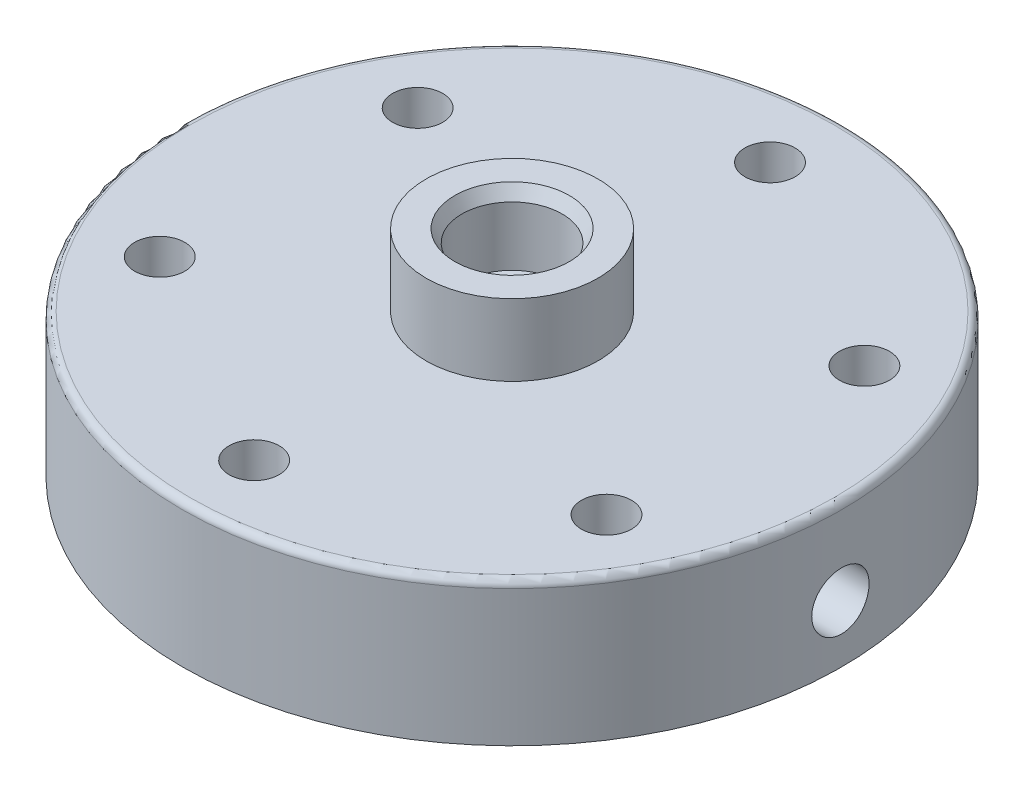
ISO-10303-21;
HEADER;
FILE_DESCRIPTION(('STEP AP214'),'2;1');
FILE_NAME('part.step','',(''),(''),'','','');
FILE_SCHEMA(('AUTOMOTIVE_DESIGN { 1 0 10303 214 1 1 1 1 }'));
ENDSEC;
DATA;
#1=APPLICATION_CONTEXT('core data for automotive mechanical design processes');
#2=APPLICATION_PROTOCOL_DEFINITION('international standard','automotive_design',2000,#1);
#3=PRODUCT_CONTEXT('',#1,'mechanical');
#4=PRODUCT('Part','Part','',(#3));
#5=PRODUCT_RELATED_PRODUCT_CATEGORY('part','',(#4));
#6=PRODUCT_DEFINITION_FORMATION('','',#4);
#7=PRODUCT_DEFINITION_CONTEXT('part definition',#1,'design');
#8=PRODUCT_DEFINITION('design','',#6,#7);
#9=PRODUCT_DEFINITION_SHAPE('','',#8);
#10=(LENGTH_UNIT() NAMED_UNIT(*) SI_UNIT(.MILLI.,.METRE.));
#11=(NAMED_UNIT(*) PLANE_ANGLE_UNIT() SI_UNIT($,.RADIAN.));
#12=(NAMED_UNIT(*) SI_UNIT($,.STERADIAN.) SOLID_ANGLE_UNIT());
#13=UNCERTAINTY_MEASURE_WITH_UNIT(LENGTH_MEASURE(1.E-05),#10,'distance_accuracy_value','');
#14=(GEOMETRIC_REPRESENTATION_CONTEXT(3) GLOBAL_UNCERTAINTY_ASSIGNED_CONTEXT((#13)) GLOBAL_UNIT_ASSIGNED_CONTEXT((#10,
#11,#12)) REPRESENTATION_CONTEXT('',''));
#15=CARTESIAN_POINT('',(0.,0.,0.));
#16=DIRECTION('',(0.,0.,1.));
#17=DIRECTION('',(1.,0.,0.));
#18=AXIS2_PLACEMENT_3D('',#15,#16,#17);
#19=CARTESIAN_POINT('',(0.,20.,0.));
#20=DIRECTION('',(0.,-1.,0.));
#21=DIRECTION('',(0.,0.,-1.));
#22=AXIS2_PLACEMENT_3D('',#19,#20,#21);
#23=CYLINDRICAL_SURFACE('',#22,46.);
#24=CARTESIAN_POINT('',(0.,19.,0.));
#25=DIRECTION('',(0.,1.,0.));
#26=DIRECTION('',(0.,0.,1.));
#27=AXIS2_PLACEMENT_3D('',#24,#25,#26);
#28=CIRCLE('',#27,46.);
#29=CARTESIAN_POINT('',(0.,19.,46.));
#30=VERTEX_POINT('',#29);
#31=EDGE_CURVE('E197',#30,#30,#28,.F.);
#32=ORIENTED_EDGE('',*,*,#31,.T.);
#33=EDGE_LOOP('',(#32));
#34=FACE_BOUND('',#33,.T.);
#35=CARTESIAN_POINT('',(0.,0.,0.));
#36=DIRECTION('',(0.,1.,0.));
#37=DIRECTION('',(0.,0.,1.));
#38=AXIS2_PLACEMENT_3D('',#35,#36,#37);
#39=CIRCLE('',#38,46.);
#40=CARTESIAN_POINT('',(0.,0.,46.));
#41=VERTEX_POINT('',#40);
#42=EDGE_CURVE('E184',#41,#41,#39,.T.);
#43=ORIENTED_EDGE('',*,*,#42,.T.);
#44=EDGE_LOOP('',(#43));
#45=FACE_BOUND('',#44,.T.);
#46=CARTESIAN_POINT('',(45.8257569495584,8.,4.));
#47=CARTESIAN_POINT('',(45.8257592529,7.77577442323266,3.99999022069832));
#48=CARTESIAN_POINT('',(45.827420373911,7.55139708322895,3.98108264099248));
#49=CARTESIAN_POINT('',(45.8338851426979,7.1088531947813,3.90593649586812));
#50=CARTESIAN_POINT('',(45.8386923314329,6.89069393397172,3.84965586532193));
#51=CARTESIAN_POINT('',(45.8509006782946,6.46705961781166,3.70140589755577));
#52=CARTESIAN_POINT('',(45.8583003450063,6.26157734933525,3.60945707647571));
#53=CARTESIAN_POINT('',(45.8748580339149,5.8690110494097,3.39251792049866));
#54=CARTESIAN_POINT('',(45.8840156854883,5.68192315255496,3.26753454795257));
#55=CARTESIAN_POINT('',(45.9030861076185,5.33088765545785,2.98769880141533));
#56=CARTESIAN_POINT('',(45.913000687119,5.16699834195564,2.83277342711226));
#57=CARTESIAN_POINT('',(45.9324513082598,4.8675132290469,2.49760627828392));
#58=CARTESIAN_POINT('',(45.9419873331913,4.73191867740846,2.31736338787004));
#59=CARTESIAN_POINT('',(45.9596237085428,4.49267637006845,1.93632769735621));
#60=CARTESIAN_POINT('',(45.9677217712603,4.38907933009617,1.73550293927632));
#61=CARTESIAN_POINT('',(45.9815502523707,4.21709718919268,1.31922689103131));
#62=CARTESIAN_POINT('',(45.9872807154839,4.14871142316868,1.10377587722316));
#63=CARTESIAN_POINT('',(45.9957156744668,4.04926161183604,0.664945572705922));
#64=CARTESIAN_POINT('',(45.9984278444434,4.01810290062262,0.441587885472249));
#65=CARTESIAN_POINT('',(46.0005466562249,3.99369898127485,-0.00720231248861332));
#66=CARTESIAN_POINT('',(45.9999533644024,4.00045301186608,-0.232634781464177));
#67=CARTESIAN_POINT('',(45.9955344216359,4.05160555151024,-0.678533303383719));
#68=CARTESIAN_POINT('',(45.9917175116836,4.09590226296142,-0.899011133019084));
#69=CARTESIAN_POINT('',(45.9812906260433,4.22072439612973,-1.32939055972902));
#70=CARTESIAN_POINT('',(45.9746806217873,4.30125018840196,-1.53929204860316));
#71=CARTESIAN_POINT('',(45.9593960403952,4.4963577352682,-1.94288377568549));
#72=CARTESIAN_POINT('',(45.9507187091837,4.61098497061715,-2.13655191869819));
#73=CARTESIAN_POINT('',(45.932274323738,4.8710085348327,-2.50193828147549));
#74=CARTESIAN_POINT('',(45.9225072454084,5.01640554411558,-2.67365601571295));
#75=CARTESIAN_POINT('',(45.9029425505567,5.33441486008561,-2.99086253715119));
#76=CARTESIAN_POINT('',(45.8931449399444,5.50711564264318,-3.1362626395445));
#77=CARTESIAN_POINT('',(45.8746558920775,5.87452214786145,-3.39602107305605));
#78=CARTESIAN_POINT('',(45.865964455857,6.06922789109,-3.51037937515944));
#79=CARTESIAN_POINT('',(45.850670411278,6.47518079364158,-3.70480521446751));
#80=CARTESIAN_POINT('',(45.8440680940838,6.68643025357772,-3.78486797239148));
#81=CARTESIAN_POINT('',(45.8337056034403,7.11944348390513,-3.90836346467413));
#82=CARTESIAN_POINT('',(45.8299453648504,7.34120701318991,-3.95179703857705));
#83=CARTESIAN_POINT('',(45.8257035170242,7.78817678693571,-4.00068860868453));
#84=CARTESIAN_POINT('',(45.8252112237107,8.01336939766032,-4.00627035728181));
#85=CARTESIAN_POINT('',(45.8275328089982,8.46148703918565,-3.97962416771679));
#86=CARTESIAN_POINT('',(45.8303466539778,8.68441209302277,-3.94739661405193));
#87=CARTESIAN_POINT('',(45.8389537309647,9.12131022373808,-3.84614988501926));
#88=CARTESIAN_POINT('',(45.8447422732169,9.33529682004083,-3.77718861590927));
#89=CARTESIAN_POINT('',(45.858642654131,9.74866282147786,-3.60449093074963));
#90=CARTESIAN_POINT('',(45.8667545333191,9.94804197173726,-3.50075390809871));
#91=CARTESIAN_POINT('',(45.8844134825169,10.3270992880489,-3.26113691800223));
#92=CARTESIAN_POINT('',(45.8939642072595,10.5067252100852,-3.12517457760168));
#93=CARTESIAN_POINT('',(45.9134124490953,10.840648770394,-2.82508520773206));
#94=CARTESIAN_POINT('',(45.9233099726793,10.994945934287,-2.66095765087739));
#95=CARTESIAN_POINT('',(45.9423685156078,11.2742553361173,-2.30866162942055));
#96=CARTESIAN_POINT('',(45.9515274669664,11.3991871027076,-2.12042923775605));
#97=CARTESIAN_POINT('',(45.9680470345569,11.6156668888614,-1.72558473478786));
#98=CARTESIAN_POINT('',(45.9754076701262,11.7072152674032,-1.51897282115266));
#99=CARTESIAN_POINT('',(45.9874917831598,11.8541917289228,-1.09352107058706));
#100=CARTESIAN_POINT('',(45.9922188753643,11.9096693393661,-0.874698450214243));
#101=CARTESIAN_POINT('',(45.99851799679,11.9830912853287,-0.430801347321802));
#102=CARTESIAN_POINT('',(46.0000900915684,12.0010364007306,-0.205726994804518));
#103=CARTESIAN_POINT('',(45.9999021602536,11.9988744958374,0.243491894884627));
#104=CARTESIAN_POINT('',(45.9981531072966,11.9788927865902,0.467637050347374));
#105=CARTESIAN_POINT('',(45.9915410873719,11.9017060502011,0.90937492257315));
#106=CARTESIAN_POINT('',(45.9866781164929,11.8445009763045,1.12696763110556));
#107=CARTESIAN_POINT('',(45.9743837234326,11.6945238102343,1.54943018460914));
#108=CARTESIAN_POINT('',(45.9669524855247,11.6017542697615,1.75430094113752));
#109=CARTESIAN_POINT('',(45.9503523182712,11.3832956492401,2.1455808043822));
#110=CARTESIAN_POINT('',(45.9411834128787,11.2576070229602,2.33199016552824));
#111=CARTESIAN_POINT('',(45.9221005338321,10.9764075200983,2.68169741837223));
#112=CARTESIAN_POINT('',(45.9121842991298,10.820803736764,2.84492048041319));
#113=CARTESIAN_POINT('',(45.8927436381485,10.4843629460579,3.14300123474661));
#114=CARTESIAN_POINT('',(45.8832193071528,10.3035198486581,3.27785206131377));
#115=CARTESIAN_POINT('',(45.8656201830606,9.92135267465077,3.51556036878055));
#116=CARTESIAN_POINT('',(45.8575483364789,9.71998823540091,3.61835311929828));
#117=CARTESIAN_POINT('',(45.8438038501868,9.30292314647025,3.78853603666767));
#118=CARTESIAN_POINT('',(45.838128464102,9.08723923706336,3.85596675043421));
#119=CARTESIAN_POINT('',(45.8312733845173,8.72524412271519,3.93640984643492));
#120=CARTESIAN_POINT('',(45.8292142857283,8.58125842839594,3.96022427649646));
#121=CARTESIAN_POINT('',(45.8264553214086,8.29153654166246,3.99202250917625));
#122=CARTESIAN_POINT('',(45.8257554518344,8.14580035445712,4.00000635888943));
#123=CARTESIAN_POINT('',(45.8257569495584,8.,4.));
#124=B_SPLINE_CURVE_WITH_KNOTS('',3,(#46,#47,#48,#49,#50,#51,#52,#53,#54,#55,#56,#57,#58,#59,
#60,#61,#62,#63,#64,#65,#66,#67,#68,#69,#70,#71,#72,#73,#74,#75,#76,#77,#78,#79,#80,#81,#82,#83,
#84,#85,#86,#87,#88,#89,#90,#91,#92,#93,#94,#95,#96,#97,#98,#99,#100,#101,#102,#103,#104,#105,
#106,#107,#108,#109,#110,#111,#112,#113,#114,#115,#116,#117,#118,#119,#120,#121,#122,#123),
.UNSPECIFIED.,.T.,.F.,(4,2,2,2,2,2,2,2,2,2,2,2,2,2,2,2,2,2,2,2,2,2,2,2,2,2,2,2,2,2,2,2,2,2,2,2,
2,2,4),(0.,0.672144367468726,1.34504655027074,2.01756225611789,2.68993633564789,
3.36397086630315,4.03803511486633,4.71316232981279,5.38827679206224,6.06167080444288,
6.73505129535883,7.40661172404849,8.07817902168978,8.75064602815269,9.42312790652577,
10.0978353469387,10.7725434180003,11.4473454829356,12.1221320809255,12.7947114699811,
13.4672840193756,14.1387994635935,14.8103266218154,15.4835891813588,16.1568643489264,
16.8319635562739,17.5070555039268,18.1812185387189,18.8553675650324,19.5272930649873,
20.1992194089225,20.8710975521,21.5429664343535,22.2169566520649,22.8911097798494,
23.5666154470793,24.2413448612288,24.6784010614077,25.1154559613712),.UNSPECIFIED.);
#125=CARTESIAN_POINT('',(45.8257569495584,8.,4.));
#126=VERTEX_POINT('',#125);
#127=EDGE_CURVE('E246',#126,#126,#124,.T.);
#128=ORIENTED_EDGE('',*,*,#127,.F.);
#129=EDGE_LOOP('',(#128));
#130=FACE_BOUND('',#129,.T.);
#131=ADVANCED_FACE('F49',(#34,#45,#130),#23,.T.);
#132=CARTESIAN_POINT('',(0.,14.,0.));
#133=DIRECTION('',(0.,-1.,0.));
#134=DIRECTION('',(0.,0.,-1.));
#135=AXIS2_PLACEMENT_3D('',#132,#133,#134);
#136=CYLINDRICAL_SURFACE('',#135,33.);
#137=DIRECTION('',(0.,-1.,0.));
#138=VECTOR('',#137,1.);
#139=CARTESIAN_POINT('',(29.4024648652409,7.,-14.9831592078666));
#140=LINE('',#139,#138);
#141=CARTESIAN_POINT('',(29.4024648652408,14.,-14.9831592078666));
#142=VERTEX_POINT('',#141);
#143=CARTESIAN_POINT('',(29.4024648652408,0.,-14.9831592078666));
#144=VERTEX_POINT('',#143);
#145=EDGE_CURVE('E374',#142,#144,#140,.T.);
#146=ORIENTED_EDGE('',*,*,#145,.T.);
#147=CARTESIAN_POINT('',(0.,0.,0.));
#148=DIRECTION('',(0.,-1.,0.));
#149=DIRECTION('',(0.,0.,-1.));
#150=AXIS2_PLACEMENT_3D('',#147,#148,#149);
#151=CIRCLE('',#150,33.);
#152=CARTESIAN_POINT('',(29.4024648652422,0.,14.9831592078639));
#153=VERTEX_POINT('',#152);
#154=EDGE_CURVE('E172',#144,#153,#151,.T.);
#155=ORIENTED_EDGE('',*,*,#154,.T.);
#156=DIRECTION('',(0.,-1.,0.));
#157=VECTOR('',#156,1.);
#158=CARTESIAN_POINT('',(29.4024648652422,7.,14.9831592078639));
#159=LINE('',#158,#157);
#160=CARTESIAN_POINT('',(29.4024648652422,14.,14.9831592078639));
#161=VERTEX_POINT('',#160);
#162=EDGE_CURVE('E369',#153,#161,#159,.F.);
#163=ORIENTED_EDGE('',*,*,#162,.T.);
#164=CARTESIAN_POINT('',(0.,14.,0.));
#165=DIRECTION('',(0.,-1.,0.));
#166=DIRECTION('',(0.,0.,-1.));
#167=AXIS2_PLACEMENT_3D('',#164,#165,#166);
#168=CIRCLE('',#167,33.);
#169=EDGE_CURVE('E397',#142,#161,#168,.T.);
#170=ORIENTED_EDGE('',*,*,#169,.F.);
#171=EDGE_LOOP('',(#146,#155,#163,#170));
#172=FACE_BOUND('',#171,.T.);
#173=CARTESIAN_POINT('',(32.7566787083184,8.,4.));
#174=CARTESIAN_POINT('',(32.7566818366577,8.22379449651927,3.99999045298508));
#175=CARTESIAN_POINT('',(32.7589969177124,8.44773021035809,3.98115515343243));
#176=CARTESIAN_POINT('',(32.7680039727008,8.889373365523,3.90631302023377));
#177=CARTESIAN_POINT('',(32.7747005616006,9.10707398689689,3.85026699225597));
#178=CARTESIAN_POINT('',(32.7917012296198,9.52978851419071,3.70267655289125));
#179=CARTESIAN_POINT('',(32.8020029032309,9.73481077272732,3.61115580778966));
#180=CARTESIAN_POINT('',(32.8250500965597,10.126547201995,3.39526371924446));
#181=CARTESIAN_POINT('',(32.8377951872424,10.3132645781591,3.27089814151645));
#182=CARTESIAN_POINT('',(32.864368406131,10.6641144539865,2.99214417405283));
#183=CARTESIAN_POINT('',(32.8782013482531,10.8281365492641,2.83761726919589));
#184=CARTESIAN_POINT('',(32.905348295857,11.127986665219,2.50322501027308));
#185=CARTESIAN_POINT('',(32.9186622758482,11.2638133023978,2.32335841356232));
#186=CARTESIAN_POINT('',(32.9433202079721,11.5038108864133,1.94270104483964));
#187=CARTESIAN_POINT('',(32.9546579142429,11.6078822238784,1.74184703190994));
#188=CARTESIAN_POINT('',(32.9740330113373,11.7807771367326,1.325352481192));
#189=CARTESIAN_POINT('',(32.9820705176523,11.8496019456042,1.10971246115218));
#190=CARTESIAN_POINT('',(32.993905717215,11.9497211000787,0.670894532630864));
#191=CARTESIAN_POINT('',(32.9977241084167,11.9811987186027,0.447759006205902));
#192=CARTESIAN_POINT('',(33.0007614848467,12.0062977980333,-0.000657902440336723));
#193=CARTESIAN_POINT('',(32.9999806408196,11.9999206642805,-0.225939204690659));
#194=CARTESIAN_POINT('',(32.9939243045577,11.949638451385,-0.671006287963217));
#195=CARTESIAN_POINT('',(32.9886724189773,11.9059304714488,-0.890814702972183));
#196=CARTESIAN_POINT('',(32.974290708158,11.7825352080508,-1.31995337515371));
#197=CARTESIAN_POINT('',(32.9651608129403,11.7028472753272,-1.52928344316775));
#198=CARTESIAN_POINT('',(32.9440083562255,11.5095434798085,-1.93213533023985));
#199=CARTESIAN_POINT('',(32.931978510434,11.3958420033639,-2.12561567058178));
#200=CARTESIAN_POINT('',(32.9063727008439,11.1378009464467,-2.49082341217299));
#201=CARTESIAN_POINT('',(32.8927966703688,10.9934600444738,-2.66254987465172));
#202=CARTESIAN_POINT('',(32.8655155228159,10.6771327598167,-2.98053255244169));
#203=CARTESIAN_POINT('',(32.8518101368879,10.5049746541673,-3.12661796887099));
#204=CARTESIAN_POINT('',(32.8259012315593,10.1384907062635,-3.38784512845958));
#205=CARTESIAN_POINT('',(32.8136977163744,9.9441648017874,-3.50298678476122));
#206=CARTESIAN_POINT('',(32.7921742461928,9.5387127347217,-3.69906598308285));
#207=CARTESIAN_POINT('',(32.7828554012633,9.32758014384369,-3.77999036212115));
#208=CARTESIAN_POINT('',(32.7681782798095,8.89458469521924,-3.90518910413138));
#209=CARTESIAN_POINT('',(32.762819824179,8.67272232320457,-3.94946512451534));
#210=CARTESIAN_POINT('',(32.7567026814491,8.22607215318564,-3.99988519584663));
#211=CARTESIAN_POINT('',(32.7559150285832,8.00131184385607,-4.00626937814872));
#212=CARTESIAN_POINT('',(32.7589520971464,7.55392484932071,-3.98135765376567));
#213=CARTESIAN_POINT('',(32.7627767262732,7.33129812150695,-3.95006250113017));
#214=CARTESIAN_POINT('',(32.7745810041736,6.89521419985763,-3.85088243715065));
#215=CARTESIAN_POINT('',(32.7825474977128,6.68173027716842,-3.78311334910617));
#216=CARTESIAN_POINT('',(32.8017272208065,6.26915668890473,-3.6130281927127));
#217=CARTESIAN_POINT('',(32.8129405579643,6.07006750065879,-3.51071097938724));
#218=CARTESIAN_POINT('',(32.8374200222184,5.69084701770273,-3.27384173326402));
#219=CARTESIAN_POINT('',(32.8506960788503,5.51081490615677,-3.13913195401655));
#220=CARTESIAN_POINT('',(32.8777737228222,5.17582999170711,-2.84152499642419));
#221=CARTESIAN_POINT('',(32.8915753293471,5.02087810543773,-2.67862678829609));
#222=CARTESIAN_POINT('',(32.9182377149735,4.73961116971855,-2.32821925622029));
#223=CARTESIAN_POINT('',(32.931093067008,4.61345372359441,-2.1405829546922));
#224=CARTESIAN_POINT('',(32.9543337105298,4.39444633148219,-1.74664463837715));
#225=CARTESIAN_POINT('',(32.9647190492445,4.30159574863799,-1.54034298058246));
#226=CARTESIAN_POINT('',(32.9818253693875,4.15209915484651,-1.11545816602638));
#227=CARTESIAN_POINT('',(32.98855563168,4.09536138361741,-0.896907684380683));
#228=CARTESIAN_POINT('',(32.9976319498885,4.0194023139405,-0.453295431839336));
#229=CARTESIAN_POINT('',(32.9999781911159,4.00017942974683,-0.228233936570891));
#230=CARTESIAN_POINT('',(33.000021367475,3.99982420871652,0.220471313794806));
#231=CARTESIAN_POINT('',(32.9977479977708,4.01844858720769,0.444114912587442));
#232=CARTESIAN_POINT('',(32.9888663257534,4.0927447933209,0.885069092955427));
#233=CARTESIAN_POINT('',(32.9822580252319,4.14841660563101,1.10237967714821));
#234=CARTESIAN_POINT('',(32.9654458725196,4.29515239763123,1.5244721638081));
#235=CARTESIAN_POINT('',(32.9552431301393,4.38620545399445,1.72925791053233));
#236=CARTESIAN_POINT('',(32.9323730883384,4.60109385860996,2.12068092912073));
#237=CARTESIAN_POINT('',(32.9197057667317,4.72492950197568,2.30731803758764));
#238=CARTESIAN_POINT('',(32.8932241859913,5.0027703589899,2.65838965314681));
#239=CARTESIAN_POINT('',(32.8794033429218,5.15695670285065,2.82268032326465));
#240=CARTESIAN_POINT('',(32.8522257784064,5.49074781671624,3.12315293120787));
#241=CARTESIAN_POINT('',(32.8388691678779,5.67035860998341,3.25932818941034));
#242=CARTESIAN_POINT('',(32.8140805805222,6.05064490506674,3.50012370208704));
#243=CARTESIAN_POINT('',(32.8026557772711,6.25139461410864,3.60462743792878));
#244=CARTESIAN_POINT('',(32.7831085801835,6.66761744458094,3.77829295203558));
#245=CARTESIAN_POINT('',(32.7749825744407,6.88307415937034,3.84749340586574));
#246=CARTESIAN_POINT('',(32.7649388059801,7.2497201316593,3.93190579331955));
#247=CARTESIAN_POINT('',(32.7618565652437,7.39859108355957,3.9574047064634));
#248=CARTESIAN_POINT('',(32.7577254688871,7.69828663429389,3.99145496920686));
#249=CARTESIAN_POINT('',(32.7566765991008,7.84911121950999,4.00000643687607));
#250=CARTESIAN_POINT('',(32.7566787083184,8.,4.));
#251=B_SPLINE_CURVE_WITH_KNOTS('',3,(#173,#174,#175,#176,#177,#178,#179,#180,#181,#182,#183,
#184,#185,#186,#187,#188,#189,#190,#191,#192,#193,#194,#195,#196,#197,#198,#199,#200,#201,#202,
#203,#204,#205,#206,#207,#208,#209,#210,#211,#212,#213,#214,#215,#216,#217,#218,#219,#220,#221,
#222,#223,#224,#225,#226,#227,#228,#229,#230,#231,#232,#233,#234,#235,#236,#237,#238,#239,#240,
#241,#242,#243,#244,#245,#246,#247,#248,#249,#250),.UNSPECIFIED.,.T.,.F.,(4,2,2,2,2,2,2,2,2,2,2,
2,2,2,2,2,2,2,2,2,2,2,2,2,2,2,2,2,2,2,2,2,2,2,2,2,2,2,4),(0.,0.67083230252087,1.34237232097104,
2.01346510316178,2.68444015720846,3.35857240178021,4.03273771695039,4.70899650098513,
5.38523161715035,6.05813435270303,6.73101210720266,7.40035901245526,8.06971799662072,
8.74077617066324,9.41186329380664,10.087263693043,10.762665988076,11.4383278665181,
12.1139591866663,12.7853042281999,13.4566358348076,14.1258480927268,14.7950825315168,
15.467644495884,16.140231035558,16.8164150504307,17.4925861353889,18.1670321819991,
18.8414497193086,19.5115457711023,20.1816415459413,20.8515306048434,21.5214256943855,
22.1954469793233,22.8696282135606,23.5462604462507,24.2221498121776,24.6744476783457,
25.1267423934303),.UNSPECIFIED.);
#252=CARTESIAN_POINT('',(32.7566787083184,8.,4.));
#253=VERTEX_POINT('',#252);
#254=EDGE_CURVE('E54',#253,#253,#251,.T.);
#255=ORIENTED_EDGE('',*,*,#254,.F.);
#256=EDGE_LOOP('',(#255));
#257=FACE_BOUND('',#256,.T.);
#258=ADVANCED_FACE('F230',(#172,#257),#136,.F.);
#259=CARTESIAN_POINT('',(0.,20.,0.));
#260=DIRECTION('',(0.,1.,0.));
#261=DIRECTION('',(0.,0.,1.));
#262=AXIS2_PLACEMENT_3D('',#259,#260,#261);
#263=PLANE('',#262);
#264=CARTESIAN_POINT('',(0.,20.,0.));
#265=DIRECTION('',(0.,1.,0.));
#266=DIRECTION('',(0.,0.,1.));
#267=AXIS2_PLACEMENT_3D('',#264,#265,#266);
#268=CIRCLE('',#267,12.);
#269=CARTESIAN_POINT('',(0.,20.,12.));
#270=VERTEX_POINT('',#269);
#271=EDGE_CURVE('E311',#270,#270,#268,.T.);
#272=ORIENTED_EDGE('',*,*,#271,.F.);
#273=EDGE_LOOP('',(#272));
#274=FACE_BOUND('',#273,.T.);
#275=CARTESIAN_POINT('',(0.,20.,0.));
#276=DIRECTION('',(0.,1.,0.));
#277=DIRECTION('',(0.,0.,1.));
#278=AXIS2_PLACEMENT_3D('',#275,#276,#277);
#279=CIRCLE('',#278,45.);
#280=CARTESIAN_POINT('',(0.,20.,45.));
#281=VERTEX_POINT('',#280);
#282=EDGE_CURVE('E193',#281,#281,#279,.T.);
#283=ORIENTED_EDGE('',*,*,#282,.T.);
#284=EDGE_LOOP('',(#283));
#285=FACE_BOUND('',#284,.T.);
#286=CARTESIAN_POINT('',(-31.1769145362373,20.,18.0000000000014));
#287=DIRECTION('',(0.,1.,0.));
#288=DIRECTION('',(0.,0.,1.));
#289=AXIS2_PLACEMENT_3D('',#286,#287,#288);
#290=CIRCLE('',#289,3.5);
#291=CARTESIAN_POINT('',(-31.1769145362373,20.,21.5000000000014));
#292=VERTEX_POINT('',#291);
#293=EDGE_CURVE('E317',#292,#292,#290,.T.);
#294=ORIENTED_EDGE('',*,*,#293,.F.);
#295=EDGE_LOOP('',(#294));
#296=FACE_BOUND('',#295,.T.);
#297=CARTESIAN_POINT('',(31.1769145362423,20.,17.9999999999986));
#298=DIRECTION('',(0.,1.,0.));
#299=DIRECTION('',(0.,0.,1.));
#300=AXIS2_PLACEMENT_3D('',#297,#298,#299);
#301=CIRCLE('',#300,3.5);
#302=CARTESIAN_POINT('',(31.1769145362423,20.,21.4999999999986));
#303=VERTEX_POINT('',#302);
#304=EDGE_CURVE('E321',#303,#303,#301,.T.);
#305=ORIENTED_EDGE('',*,*,#304,.F.);
#306=EDGE_LOOP('',(#305));
#307=FACE_BOUND('',#306,.T.);
#308=CARTESIAN_POINT('',(0.,20.,-36.));
#309=DIRECTION('',(0.,1.,0.));
#310=DIRECTION('',(0.,0.,1.));
#311=AXIS2_PLACEMENT_3D('',#308,#309,#310);
#312=CIRCLE('',#311,3.5);
#313=CARTESIAN_POINT('',(0.,20.,-32.5));
#314=VERTEX_POINT('',#313);
#315=EDGE_CURVE('E178',#314,#314,#312,.T.);
#316=ORIENTED_EDGE('',*,*,#315,.F.);
#317=EDGE_LOOP('',(#316));
#318=FACE_BOUND('',#317,.T.);
#319=CARTESIAN_POINT('',(31.1769145362406,20.,-18.0000000000014));
#320=DIRECTION('',(0.,1.,0.));
#321=DIRECTION('',(0.,0.,1.));
#322=AXIS2_PLACEMENT_3D('',#319,#320,#321);
#323=CIRCLE('',#322,3.5);
#324=CARTESIAN_POINT('',(31.1769145362406,20.,-14.5000000000014));
#325=VERTEX_POINT('',#324);
#326=EDGE_CURVE('E179',#325,#325,#323,.T.);
#327=ORIENTED_EDGE('',*,*,#326,.F.);
#328=EDGE_LOOP('',(#327));
#329=FACE_BOUND('',#328,.T.);
#330=CARTESIAN_POINT('',(3.3106442417675E-12,20.,36.));
#331=DIRECTION('',(0.,1.,0.));
#332=DIRECTION('',(0.,0.,1.));
#333=AXIS2_PLACEMENT_3D('',#330,#331,#332);
#334=CIRCLE('',#333,3.5);
#335=CARTESIAN_POINT('',(3.3106442417675E-12,20.,39.5));
#336=VERTEX_POINT('',#335);
#337=EDGE_CURVE('E329',#336,#336,#334,.T.);
#338=ORIENTED_EDGE('',*,*,#337,.F.);
#339=EDGE_LOOP('',(#338));
#340=FACE_BOUND('',#339,.T.);
#341=CARTESIAN_POINT('',(-31.176914536239,20.,-17.9999999999985));
#342=DIRECTION('',(0.,1.,0.));
#343=DIRECTION('',(0.,0.,1.));
#344=AXIS2_PLACEMENT_3D('',#341,#342,#343);
#345=CIRCLE('',#344,3.5);
#346=CARTESIAN_POINT('',(-31.176914536239,20.,-14.4999999999985));
#347=VERTEX_POINT('',#346);
#348=EDGE_CURVE('E332',#347,#347,#345,.T.);
#349=ORIENTED_EDGE('',*,*,#348,.F.);
#350=EDGE_LOOP('',(#349));
#351=FACE_BOUND('',#350,.T.);
#352=ADVANCED_FACE('F236',(#274,#285,#296,#307,#318,#329,#340,#351),#263,.T.);
#353=CARTESIAN_POINT('',(0.,0.,0.));
#354=DIRECTION('',(0.,1.,0.));
#355=DIRECTION('',(0.,0.,1.));
#356=AXIS2_PLACEMENT_3D('',#353,#354,#355);
#357=PLANE('',#356);
#358=ORIENTED_EDGE('',*,*,#42,.F.);
#359=EDGE_LOOP('',(#358));
#360=FACE_BOUND('',#359,.T.);
#361=CARTESIAN_POINT('',(3.3106442417675E-12,0.,36.));
#362=DIRECTION('',(0.,1.,0.));
#363=DIRECTION('',(0.,0.,1.));
#364=AXIS2_PLACEMENT_3D('',#361,#362,#363);
#365=CIRCLE('',#364,3.5);
#366=CARTESIAN_POINT('',(-1.72543592966121,0.,32.9548611111113));
#367=VERTEX_POINT('',#366);
#368=CARTESIAN_POINT('',(1.72543592966727,0.,32.954861111111));
#369=VERTEX_POINT('',#368);
#370=EDGE_CURVE('E349',#367,#369,#365,.T.);
#371=ORIENTED_EDGE('',*,*,#370,.T.);
#372=CARTESIAN_POINT('',(27.6770289355805,0.,17.9717019032434));
#373=VERTEX_POINT('',#372);
#374=EDGE_CURVE('E363',#373,#369,#151,.T.);
#375=ORIENTED_EDGE('',*,*,#374,.F.);
#376=CARTESIAN_POINT('',(31.1769145362423,0.,17.9999999999986));
#377=DIRECTION('',(0.,1.,0.));
#378=DIRECTION('',(0.,0.,1.));
#379=AXIS2_PLACEMENT_3D('',#376,#377,#378);
#380=CIRCLE('',#379,3.5);
#381=EDGE_CURVE('E353',#373,#153,#380,.T.);
#382=ORIENTED_EDGE('',*,*,#381,.T.);
#383=ORIENTED_EDGE('',*,*,#154,.F.);
#384=CARTESIAN_POINT('',(31.1769145362406,0.,-18.0000000000014));
#385=DIRECTION('',(0.,1.,0.));
#386=DIRECTION('',(0.,0.,1.));
#387=AXIS2_PLACEMENT_3D('',#384,#385,#386);
#388=CIRCLE('',#387,3.5);
#389=CARTESIAN_POINT('',(27.6770289355788,0.,-17.971701903246));
#390=VERTEX_POINT('',#389);
#391=EDGE_CURVE('E169',#144,#390,#388,.T.);
#392=ORIENTED_EDGE('',*,*,#391,.T.);
#393=CARTESIAN_POINT('',(1.72543592966437,0.,-32.9548611111111));
#394=VERTEX_POINT('',#393);
#395=EDGE_CURVE('E150',#394,#390,#151,.T.);
#396=ORIENTED_EDGE('',*,*,#395,.F.);
#397=CARTESIAN_POINT('',(0.,0.,-36.));
#398=DIRECTION('',(0.,1.,0.));
#399=DIRECTION('',(0.,0.,1.));
#400=AXIS2_PLACEMENT_3D('',#397,#398,#399);
#401=CIRCLE('',#400,3.5);
#402=CARTESIAN_POINT('',(-1.72543592966437,0.,-32.9548611111111));
#403=VERTEX_POINT('',#402);
#404=EDGE_CURVE('E166',#394,#403,#401,.T.);
#405=ORIENTED_EDGE('',*,*,#404,.T.);
#406=CARTESIAN_POINT('',(-27.6770289355772,0.,-17.9717019032485));
#407=VERTEX_POINT('',#406);
#408=EDGE_CURVE('E174',#407,#403,#151,.T.);
#409=ORIENTED_EDGE('',*,*,#408,.F.);
#410=CARTESIAN_POINT('',(-31.176914536239,0.,-17.9999999999985));
#411=DIRECTION('',(0.,1.,0.));
#412=DIRECTION('',(0.,0.,1.));
#413=AXIS2_PLACEMENT_3D('',#410,#411,#412);
#414=CIRCLE('',#413,3.5);
#415=CARTESIAN_POINT('',(-29.4024648652436,0.,-14.9831592078612));
#416=VERTEX_POINT('',#415);
#417=EDGE_CURVE('E336',#407,#416,#414,.T.);
#418=ORIENTED_EDGE('',*,*,#417,.T.);
#419=CARTESIAN_POINT('',(-29.4024648652422,0.,14.9831592078639));
#420=VERTEX_POINT('',#419);
#421=EDGE_CURVE('E460',#420,#416,#151,.T.);
#422=ORIENTED_EDGE('',*,*,#421,.F.);
#423=CARTESIAN_POINT('',(-31.1769145362373,0.,18.0000000000014));
#424=DIRECTION('',(0.,1.,0.));
#425=DIRECTION('',(0.,0.,1.));
#426=AXIS2_PLACEMENT_3D('',#423,#424,#425);
#427=CIRCLE('',#426,3.5);
#428=CARTESIAN_POINT('',(-27.6770289355755,0.,17.971701903251));
#429=VERTEX_POINT('',#428);
#430=EDGE_CURVE('E335',#420,#429,#427,.T.);
#431=ORIENTED_EDGE('',*,*,#430,.T.);
#432=EDGE_CURVE('E462',#367,#429,#151,.T.);
#433=ORIENTED_EDGE('',*,*,#432,.F.);
#434=EDGE_LOOP('',(#371,#375,#382,#383,#392,#396,#405,#409,#418,#422,#431,#433));
#435=FACE_BOUND('',#434,.T.);
#436=ADVANCED_FACE('F164',(#360,#435),#357,.F.);
#437=CARTESIAN_POINT('',(0.,20.,-36.));
#438=DIRECTION('',(0.,-1.,0.));
#439=DIRECTION('',(0.,0.,-1.));
#440=AXIS2_PLACEMENT_3D('',#437,#438,#439);
#441=CYLINDRICAL_SURFACE('',#440,3.5);
#442=DIRECTION('',(0.,-1.,0.));
#443=VECTOR('',#442,1.);
#444=CARTESIAN_POINT('',(-1.72543592966432,7.,-32.9548611111111));
#445=LINE('',#444,#443);
#446=CARTESIAN_POINT('',(-1.72543592966437,14.,-32.9548611111111));
#447=VERTEX_POINT('',#446);
#448=EDGE_CURVE('E80',#403,#447,#445,.F.);
#449=ORIENTED_EDGE('',*,*,#448,.F.);
#450=ORIENTED_EDGE('',*,*,#404,.F.);
#451=DIRECTION('',(0.,-1.,0.));
#452=VECTOR('',#451,1.);
#453=CARTESIAN_POINT('',(1.72543592966432,7.,-32.9548611111111));
#454=LINE('',#453,#452);
#455=CARTESIAN_POINT('',(1.72543592966437,14.,-32.9548611111111));
#456=VERTEX_POINT('',#455);
#457=EDGE_CURVE('E147',#456,#394,#454,.T.);
#458=ORIENTED_EDGE('',*,*,#457,.F.);
#459=CARTESIAN_POINT('',(0.,14.,-36.));
#460=DIRECTION('',(0.,-1.,0.));
#461=DIRECTION('',(0.,0.,-1.));
#462=AXIS2_PLACEMENT_3D('',#459,#460,#461);
#463=CIRCLE('',#462,3.5);
#464=EDGE_CURVE('E394',#456,#447,#463,.T.);
#465=ORIENTED_EDGE('',*,*,#464,.T.);
#466=EDGE_LOOP('',(#449,#450,#458,#465));
#467=FACE_BOUND('',#466,.T.);
#468=ORIENTED_EDGE('',*,*,#315,.T.);
#469=EDGE_LOOP('',(#468));
#470=FACE_BOUND('',#469,.T.);
#471=ADVANCED_FACE('F175',(#467,#470),#441,.F.);
#472=CARTESIAN_POINT('',(31.1769145362406,20.,-18.0000000000014));
#473=DIRECTION('',(0.,-1.,0.));
#474=DIRECTION('',(0.,0.,-1.));
#475=AXIS2_PLACEMENT_3D('',#472,#473,#474);
#476=CYLINDRICAL_SURFACE('',#475,3.5);
#477=DIRECTION('',(0.,-1.,0.));
#478=VECTOR('',#477,1.);
#479=CARTESIAN_POINT('',(27.6770289355788,7.,-17.971701903246));
#480=LINE('',#479,#478);
#481=CARTESIAN_POINT('',(27.6770289355788,14.,-17.971701903246));
#482=VERTEX_POINT('',#481);
#483=EDGE_CURVE('E158',#390,#482,#480,.F.);
#484=ORIENTED_EDGE('',*,*,#483,.F.);
#485=ORIENTED_EDGE('',*,*,#391,.F.);
#486=ORIENTED_EDGE('',*,*,#145,.F.);
#487=CARTESIAN_POINT('',(31.1769145362406,14.,-18.0000000000014));
#488=DIRECTION('',(0.,-1.,0.));
#489=DIRECTION('',(0.,0.,-1.));
#490=AXIS2_PLACEMENT_3D('',#487,#488,#489);
#491=CIRCLE('',#490,3.5);
#492=EDGE_CURVE('E393',#142,#482,#491,.T.);
#493=ORIENTED_EDGE('',*,*,#492,.T.);
#494=EDGE_LOOP('',(#484,#485,#486,#493));
#495=FACE_BOUND('',#494,.T.);
#496=ORIENTED_EDGE('',*,*,#326,.T.);
#497=EDGE_LOOP('',(#496));
#498=FACE_BOUND('',#497,.T.);
#499=ADVANCED_FACE('F296',(#495,#498),#476,.F.);
#500=CARTESIAN_POINT('',(31.1769145362423,20.,17.9999999999986));
#501=DIRECTION('',(0.,-1.,0.));
#502=DIRECTION('',(0.,0.,-1.));
#503=AXIS2_PLACEMENT_3D('',#500,#501,#502);
#504=CYLINDRICAL_SURFACE('',#503,3.5);
#505=ORIENTED_EDGE('',*,*,#162,.F.);
#506=ORIENTED_EDGE('',*,*,#381,.F.);
#507=DIRECTION('',(0.,-1.,0.));
#508=VECTOR('',#507,1.);
#509=CARTESIAN_POINT('',(27.6770289355804,7.,17.9717019032434));
#510=LINE('',#509,#508);
#511=CARTESIAN_POINT('',(27.6770289355805,14.,17.9717019032434));
#512=VERTEX_POINT('',#511);
#513=EDGE_CURVE('E368',#512,#373,#510,.T.);
#514=ORIENTED_EDGE('',*,*,#513,.F.);
#515=CARTESIAN_POINT('',(31.1769145362423,14.,17.9999999999986));
#516=DIRECTION('',(0.,-1.,0.));
#517=DIRECTION('',(0.,0.,-1.));
#518=AXIS2_PLACEMENT_3D('',#515,#516,#517);
#519=CIRCLE('',#518,3.5);
#520=EDGE_CURVE('E370',#512,#161,#519,.T.);
#521=ORIENTED_EDGE('',*,*,#520,.T.);
#522=EDGE_LOOP('',(#505,#506,#514,#521));
#523=FACE_BOUND('',#522,.T.);
#524=ORIENTED_EDGE('',*,*,#304,.T.);
#525=EDGE_LOOP('',(#524));
#526=FACE_BOUND('',#525,.T.);
#527=ADVANCED_FACE('F292',(#523,#526),#504,.F.);
#528=CARTESIAN_POINT('',(3.3106442417675E-12,20.,36.));
#529=DIRECTION('',(0.,-1.,0.));
#530=DIRECTION('',(0.,0.,-1.));
#531=AXIS2_PLACEMENT_3D('',#528,#529,#530);
#532=CYLINDRICAL_SURFACE('',#531,3.5);
#533=DIRECTION('',(0.,-1.,0.));
#534=VECTOR('',#533,1.);
#535=CARTESIAN_POINT('',(1.72543592966735,7.,32.954861111111));
#536=LINE('',#535,#534);
#537=CARTESIAN_POINT('',(1.72543592966727,14.,32.954861111111));
#538=VERTEX_POINT('',#537);
#539=EDGE_CURVE('E379',#369,#538,#536,.F.);
#540=ORIENTED_EDGE('',*,*,#539,.F.);
#541=ORIENTED_EDGE('',*,*,#370,.F.);
#542=DIRECTION('',(0.,-1.,0.));
#543=VECTOR('',#542,1.);
#544=CARTESIAN_POINT('',(-1.72543592966129,7.,32.9548611111113));
#545=LINE('',#544,#543);
#546=CARTESIAN_POINT('',(-1.72543592966121,14.,32.9548611111113));
#547=VERTEX_POINT('',#546);
#548=EDGE_CURVE('E416',#547,#367,#545,.T.);
#549=ORIENTED_EDGE('',*,*,#548,.F.);
#550=CARTESIAN_POINT('',(3.3106442417675E-12,14.,36.));
#551=DIRECTION('',(0.,-1.,0.));
#552=DIRECTION('',(0.,0.,-1.));
#553=AXIS2_PLACEMENT_3D('',#550,#551,#552);
#554=CIRCLE('',#553,3.5);
#555=EDGE_CURVE('E407',#547,#538,#554,.T.);
#556=ORIENTED_EDGE('',*,*,#555,.T.);
#557=EDGE_LOOP('',(#540,#541,#549,#556));
#558=FACE_BOUND('',#557,.T.);
#559=ORIENTED_EDGE('',*,*,#337,.T.);
#560=EDGE_LOOP('',(#559));
#561=FACE_BOUND('',#560,.T.);
#562=ADVANCED_FACE('F288',(#558,#561),#532,.F.);
#563=CARTESIAN_POINT('',(-31.1769145362373,20.,18.0000000000014));
#564=DIRECTION('',(0.,-1.,0.));
#565=DIRECTION('',(0.,0.,-1.));
#566=AXIS2_PLACEMENT_3D('',#563,#564,#565);
#567=CYLINDRICAL_SURFACE('',#566,3.5);
#568=DIRECTION('',(0.,-1.,0.));
#569=VECTOR('',#568,1.);
#570=CARTESIAN_POINT('',(-27.6770289355754,7.,17.9717019032511));
#571=LINE('',#570,#569);
#572=CARTESIAN_POINT('',(-27.6770289355755,14.,17.971701903251));
#573=VERTEX_POINT('',#572);
#574=EDGE_CURVE('E413',#429,#573,#571,.F.);
#575=ORIENTED_EDGE('',*,*,#574,.F.);
#576=ORIENTED_EDGE('',*,*,#430,.F.);
#577=DIRECTION('',(0.,-1.,0.));
#578=VECTOR('',#577,1.);
#579=CARTESIAN_POINT('',(-29.4024648652423,7.,14.9831592078638));
#580=LINE('',#579,#578);
#581=CARTESIAN_POINT('',(-29.4024648652422,14.,14.9831592078639));
#582=VERTEX_POINT('',#581);
#583=EDGE_CURVE('E405',#582,#420,#580,.T.);
#584=ORIENTED_EDGE('',*,*,#583,.F.);
#585=CARTESIAN_POINT('',(-31.1769145362373,14.,18.0000000000014));
#586=DIRECTION('',(0.,-1.,0.));
#587=DIRECTION('',(0.,0.,-1.));
#588=AXIS2_PLACEMENT_3D('',#585,#586,#587);
#589=CIRCLE('',#588,3.5);
#590=EDGE_CURVE('E396',#582,#573,#589,.T.);
#591=ORIENTED_EDGE('',*,*,#590,.T.);
#592=EDGE_LOOP('',(#575,#576,#584,#591));
#593=FACE_BOUND('',#592,.T.);
#594=ORIENTED_EDGE('',*,*,#293,.T.);
#595=EDGE_LOOP('',(#594));
#596=FACE_BOUND('',#595,.T.);
#597=ADVANCED_FACE('F284',(#593,#596),#567,.F.);
#598=CARTESIAN_POINT('',(-31.176914536239,20.,-17.9999999999985));
#599=DIRECTION('',(0.,-1.,0.));
#600=DIRECTION('',(0.,0.,-1.));
#601=AXIS2_PLACEMENT_3D('',#598,#599,#600);
#602=CYLINDRICAL_SURFACE('',#601,3.5);
#603=DIRECTION('',(0.,-1.,0.));
#604=VECTOR('',#603,1.);
#605=CARTESIAN_POINT('',(-29.4024648652437,7.,-14.9831592078611));
#606=LINE('',#605,#604);
#607=CARTESIAN_POINT('',(-29.4024648652436,14.,-14.9831592078612));
#608=VERTEX_POINT('',#607);
#609=EDGE_CURVE('E208',#416,#608,#606,.F.);
#610=ORIENTED_EDGE('',*,*,#609,.F.);
#611=ORIENTED_EDGE('',*,*,#417,.F.);
#612=DIRECTION('',(0.,-1.,0.));
#613=VECTOR('',#612,1.);
#614=CARTESIAN_POINT('',(-27.6770289355771,7.,-17.9717019032486));
#615=LINE('',#614,#613);
#616=CARTESIAN_POINT('',(-27.6770289355772,14.,-17.9717019032485));
#617=VERTEX_POINT('',#616);
#618=EDGE_CURVE('E205',#617,#407,#615,.T.);
#619=ORIENTED_EDGE('',*,*,#618,.F.);
#620=CARTESIAN_POINT('',(-31.176914536239,14.,-17.9999999999985));
#621=DIRECTION('',(0.,-1.,0.));
#622=DIRECTION('',(0.,0.,-1.));
#623=AXIS2_PLACEMENT_3D('',#620,#621,#622);
#624=CIRCLE('',#623,3.5);
#625=EDGE_CURVE('E201',#617,#608,#624,.T.);
#626=ORIENTED_EDGE('',*,*,#625,.T.);
#627=EDGE_LOOP('',(#610,#611,#619,#626));
#628=FACE_BOUND('',#627,.T.);
#629=ORIENTED_EDGE('',*,*,#348,.T.);
#630=EDGE_LOOP('',(#629));
#631=FACE_BOUND('',#630,.T.);
#632=ADVANCED_FACE('F281',(#628,#631),#602,.F.);
#633=CARTESIAN_POINT('',(0.,19.,0.));
#634=DIRECTION('',(0.,1.,0.));
#635=DIRECTION('',(0.,0.,1.));
#636=AXIS2_PLACEMENT_3D('',#633,#634,#635);
#637=TOROIDAL_SURFACE('',#636,45.,1.);
#638=ORIENTED_EDGE('',*,*,#31,.F.);
#639=EDGE_LOOP('',(#638));
#640=FACE_BOUND('',#639,.T.);
#641=ORIENTED_EDGE('',*,*,#282,.F.);
#642=EDGE_LOOP('',(#641));
#643=FACE_BOUND('',#642,.T.);
#644=ADVANCED_FACE('F244',(#640,#643),#637,.T.);
#645=CARTESIAN_POINT('',(0.,30.,0.));
#646=DIRECTION('',(0.,-1.,0.));
#647=DIRECTION('',(0.,0.,-1.));
#648=AXIS2_PLACEMENT_3D('',#645,#646,#647);
#649=CYLINDRICAL_SURFACE('',#648,12.);
#650=CARTESIAN_POINT('',(0.,30.,0.));
#651=DIRECTION('',(0.,1.,0.));
#652=DIRECTION('',(0.,0.,1.));
#653=AXIS2_PLACEMENT_3D('',#650,#651,#652);
#654=CIRCLE('',#653,12.);
#655=CARTESIAN_POINT('',(0.,30.,12.));
#656=VERTEX_POINT('',#655);
#657=EDGE_CURVE('E343',#656,#656,#654,.T.);
#658=ORIENTED_EDGE('',*,*,#657,.F.);
#659=EDGE_LOOP('',(#658));
#660=FACE_BOUND('',#659,.T.);
#661=ORIENTED_EDGE('',*,*,#271,.T.);
#662=EDGE_LOOP('',(#661));
#663=FACE_BOUND('',#662,.T.);
#664=ADVANCED_FACE('F276',(#660,#663),#649,.T.);
#665=CARTESIAN_POINT('',(0.,30.,0.));
#666=DIRECTION('',(0.,1.,0.));
#667=DIRECTION('',(0.,0.,1.));
#668=AXIS2_PLACEMENT_3D('',#665,#666,#667);
#669=PLANE('',#668);
#670=CARTESIAN_POINT('',(0.,30.,0.));
#671=DIRECTION('',(0.,1.,0.));
#672=DIRECTION('',(0.,0.,1.));
#673=AXIS2_PLACEMENT_3D('',#670,#671,#672);
#674=CIRCLE('',#673,7.99999999999998);
#675=CARTESIAN_POINT('',(0.,30.,7.99999999999998));
#676=VERTEX_POINT('',#675);
#677=EDGE_CURVE('E11',#676,#676,#674,.F.);
#678=ORIENTED_EDGE('',*,*,#677,.T.);
#679=EDGE_LOOP('',(#678));
#680=FACE_BOUND('',#679,.T.);
#681=ORIENTED_EDGE('',*,*,#657,.T.);
#682=EDGE_LOOP('',(#681));
#683=FACE_BOUND('',#682,.T.);
#684=ADVANCED_FACE('F273',(#680,#683),#669,.T.);
#685=ORIENTED_EDGE('',*,*,#448,.T.);
#686=EDGE_CURVE('E171',#617,#447,#168,.T.);
#687=ORIENTED_EDGE('',*,*,#686,.F.);
#688=ORIENTED_EDGE('',*,*,#618,.T.);
#689=ORIENTED_EDGE('',*,*,#408,.T.);
#690=EDGE_LOOP('',(#685,#687,#688,#689));
#691=FACE_BOUND('',#690,.T.);
#692=ADVANCED_FACE('F238',(#691),#136,.F.);
#693=ORIENTED_EDGE('',*,*,#457,.T.);
#694=ORIENTED_EDGE('',*,*,#395,.T.);
#695=ORIENTED_EDGE('',*,*,#483,.T.);
#696=EDGE_CURVE('E153',#456,#482,#168,.T.);
#697=ORIENTED_EDGE('',*,*,#696,.F.);
#698=EDGE_LOOP('',(#693,#694,#695,#697));
#699=FACE_BOUND('',#698,.T.);
#700=ADVANCED_FACE('F149',(#699),#136,.F.);
#701=ORIENTED_EDGE('',*,*,#513,.T.);
#702=ORIENTED_EDGE('',*,*,#374,.T.);
#703=ORIENTED_EDGE('',*,*,#539,.T.);
#704=EDGE_CURVE('E424',#512,#538,#168,.T.);
#705=ORIENTED_EDGE('',*,*,#704,.F.);
#706=EDGE_LOOP('',(#701,#702,#703,#705));
#707=FACE_BOUND('',#706,.T.);
#708=ADVANCED_FACE('F423',(#707),#136,.F.);
#709=ORIENTED_EDGE('',*,*,#548,.T.);
#710=ORIENTED_EDGE('',*,*,#432,.T.);
#711=ORIENTED_EDGE('',*,*,#574,.T.);
#712=EDGE_CURVE('E430',#547,#573,#168,.T.);
#713=ORIENTED_EDGE('',*,*,#712,.F.);
#714=EDGE_LOOP('',(#709,#710,#711,#713));
#715=FACE_BOUND('',#714,.T.);
#716=ADVANCED_FACE('F271',(#715),#136,.F.);
#717=ORIENTED_EDGE('',*,*,#583,.T.);
#718=ORIENTED_EDGE('',*,*,#421,.T.);
#719=ORIENTED_EDGE('',*,*,#609,.T.);
#720=EDGE_CURVE('E72',#582,#608,#168,.T.);
#721=ORIENTED_EDGE('',*,*,#720,.F.);
#722=EDGE_LOOP('',(#717,#718,#719,#721));
#723=FACE_BOUND('',#722,.T.);
#724=ADVANCED_FACE('F239',(#723),#136,.F.);
#725=CARTESIAN_POINT('',(0.,14.,0.));
#726=DIRECTION('',(0.,-1.,0.));
#727=DIRECTION('',(0.,0.,-1.));
#728=AXIS2_PLACEMENT_3D('',#725,#726,#727);
#729=PLANE('',#728);
#730=CARTESIAN_POINT('',(0.,14.,0.));
#731=DIRECTION('',(0.,-1.,0.));
#732=DIRECTION('',(0.,0.,-1.));
#733=AXIS2_PLACEMENT_3D('',#730,#731,#732);
#734=CIRCLE('',#733,2.5);
#735=CARTESIAN_POINT('',(0.,14.,-2.5));
#736=VERTEX_POINT('',#735);
#737=EDGE_CURVE('E438',#736,#736,#734,.T.);
#738=ORIENTED_EDGE('',*,*,#737,.F.);
#739=EDGE_LOOP('',(#738));
#740=FACE_BOUND('',#739,.T.);
#741=ORIENTED_EDGE('',*,*,#696,.T.);
#742=ORIENTED_EDGE('',*,*,#492,.F.);
#743=ORIENTED_EDGE('',*,*,#169,.T.);
#744=ORIENTED_EDGE('',*,*,#520,.F.);
#745=ORIENTED_EDGE('',*,*,#704,.T.);
#746=ORIENTED_EDGE('',*,*,#555,.F.);
#747=ORIENTED_EDGE('',*,*,#712,.T.);
#748=ORIENTED_EDGE('',*,*,#590,.F.);
#749=ORIENTED_EDGE('',*,*,#720,.T.);
#750=ORIENTED_EDGE('',*,*,#625,.F.);
#751=ORIENTED_EDGE('',*,*,#686,.T.);
#752=ORIENTED_EDGE('',*,*,#464,.F.);
#753=EDGE_LOOP('',(#741,#742,#743,#744,#745,#746,#747,#748,#749,#750,#751,#752));
#754=FACE_BOUND('',#753,.T.);
#755=ADVANCED_FACE('F264',(#740,#754),#729,.T.);
#756=CARTESIAN_POINT('',(0.,20.,0.));
#757=DIRECTION('',(0.,-1.,0.));
#758=DIRECTION('',(0.,0.,-1.));
#759=AXIS2_PLACEMENT_3D('',#756,#757,#758);
#760=CYLINDRICAL_SURFACE('',#759,2.5);
#761=CARTESIAN_POINT('',(0.,20.,0.));
#762=DIRECTION('',(0.,-1.,0.));
#763=DIRECTION('',(0.,0.,-1.));
#764=AXIS2_PLACEMENT_3D('',#761,#762,#763);
#765=CIRCLE('',#764,2.5);
#766=CARTESIAN_POINT('',(0.,20.,-2.5));
#767=VERTEX_POINT('',#766);
#768=EDGE_CURVE('E441',#767,#767,#765,.T.);
#769=ORIENTED_EDGE('',*,*,#768,.F.);
#770=EDGE_LOOP('',(#769));
#771=FACE_BOUND('',#770,.T.);
#772=ORIENTED_EDGE('',*,*,#737,.T.);
#773=EDGE_LOOP('',(#772));
#774=FACE_BOUND('',#773,.T.);
#775=ADVANCED_FACE('F259',(#771,#774),#760,.F.);
#776=CARTESIAN_POINT('',(0.,20.,0.));
#777=DIRECTION('',(0.,1.,0.));
#778=DIRECTION('',(0.,0.,1.));
#779=AXIS2_PLACEMENT_3D('',#776,#777,#778);
#780=PLANE('',#779);
#781=CARTESIAN_POINT('',(0.,20.,0.));
#782=DIRECTION('',(0.,1.,0.));
#783=DIRECTION('',(0.,0.,1.));
#784=AXIS2_PLACEMENT_3D('',#781,#782,#783);
#785=CIRCLE('',#784,7.);
#786=CARTESIAN_POINT('',(0.,20.,7.));
#787=VERTEX_POINT('',#786);
#788=EDGE_CURVE('E253',#787,#787,#785,.T.);
#789=ORIENTED_EDGE('',*,*,#788,.T.);
#790=EDGE_LOOP('',(#789));
#791=FACE_BOUND('',#790,.T.);
#792=ORIENTED_EDGE('',*,*,#768,.T.);
#793=EDGE_LOOP('',(#792));
#794=FACE_BOUND('',#793,.T.);
#795=ADVANCED_FACE('F226',(#791,#794),#780,.T.);
#796=CARTESIAN_POINT('',(0.,20.,0.));
#797=DIRECTION('',(0.,1.,0.));
#798=DIRECTION('',(0.,0.,1.));
#799=AXIS2_PLACEMENT_3D('',#796,#797,#798);
#800=CYLINDRICAL_SURFACE('',#799,7.);
#801=CARTESIAN_POINT('',(0.,28.2679491924312,0.));
#802=DIRECTION('',(0.,1.,0.));
#803=DIRECTION('',(0.,0.,1.));
#804=AXIS2_PLACEMENT_3D('',#801,#802,#803);
#805=CIRCLE('',#804,7.);
#806=CARTESIAN_POINT('',(0.,28.2679491924312,7.));
#807=VERTEX_POINT('',#806);
#808=EDGE_CURVE('E65',#807,#807,#805,.T.);
#809=ORIENTED_EDGE('',*,*,#808,.T.);
#810=EDGE_LOOP('',(#809));
#811=FACE_BOUND('',#810,.T.);
#812=ORIENTED_EDGE('',*,*,#788,.F.);
#813=EDGE_LOOP('',(#812));
#814=FACE_BOUND('',#813,.T.);
#815=ADVANCED_FACE('F215',(#811,#814),#800,.F.);
#816=CARTESIAN_POINT('',(0.,28.2679491924312,0.));
#817=DIRECTION('',(0.,1.,0.));
#818=DIRECTION('',(0.,0.,1.));
#819=AXIS2_PLACEMENT_3D('',#816,#817,#818);
#820=CONICAL_SURFACE('',#819,7.,0.523598775598303);
#821=CARTESIAN_POINT('',(0.,30.,7.99999999999998));
#822=CARTESIAN_POINT('',(0.,29.9819578040878,7.98958333333331));
#823=CARTESIAN_POINT('',(0.,29.9639156081756,7.97916666666665));
#824=CARTESIAN_POINT('',(0.,29.9278312163513,7.95833333333331));
#825=CARTESIAN_POINT('',(0.,29.9097890204391,7.94791666666664));
#826=CARTESIAN_POINT('',(0.,29.8737046286148,7.92708333333331));
#827=CARTESIAN_POINT('',(0.,29.8556624327026,7.91666666666665));
#828=CARTESIAN_POINT('',(0.,29.8195780408782,7.89583333333332));
#829=CARTESIAN_POINT('',(0.,29.8015358449661,7.88541666666665));
#830=CARTESIAN_POINT('',(0.,29.7654514531417,7.86458333333331));
#831=CARTESIAN_POINT('',(0.,29.7474092572295,7.85416666666665));
#832=CARTESIAN_POINT('',(0.,29.7113248654052,7.83333333333332));
#833=CARTESIAN_POINT('',(0.,29.693282669493,7.82291666666665));
#834=CARTESIAN_POINT('',(0.,29.6571982776687,7.80208333333332));
#835=CARTESIAN_POINT('',(0.,29.6391560817565,7.79166666666665));
#836=CARTESIAN_POINT('',(0.,29.6030716899321,7.77083333333332));
#837=CARTESIAN_POINT('',(0.,29.58502949402,7.76041666666665));
#838=CARTESIAN_POINT('',(0.,29.5489451021956,7.73958333333332));
#839=CARTESIAN_POINT('',(0.,29.5309029062834,7.72916666666665));
#840=CARTESIAN_POINT('',(0.,29.4948185144591,7.70833333333332));
#841=CARTESIAN_POINT('',(0.,29.4767763185469,7.69791666666665));
#842=CARTESIAN_POINT('',(0.,29.4406919267226,7.67708333333332));
#843=CARTESIAN_POINT('',(0.,29.4226497308104,7.66666666666665));
#844=CARTESIAN_POINT('',(0.,29.386565338986,7.64583333333332));
#845=CARTESIAN_POINT('',(0.,29.3685231430739,7.63541666666665));
#846=CARTESIAN_POINT('',(0.,29.3324387512495,7.61458333333332));
#847=CARTESIAN_POINT('',(0.,29.3143965553373,7.60416666666665));
#848=CARTESIAN_POINT('',(0.,29.278312163513,7.58333333333332));
#849=CARTESIAN_POINT('',(0.,29.2602699676008,7.57291666666665));
#850=CARTESIAN_POINT('',(0.,29.2241855757765,7.55208333333332));
#851=CARTESIAN_POINT('',(0.,29.2061433798643,7.54166666666665));
#852=CARTESIAN_POINT('',(0.,29.1700589880399,7.52083333333332));
#853=CARTESIAN_POINT('',(0.,29.1520167921278,7.51041666666665));
#854=CARTESIAN_POINT('',(0.,29.1159324003034,7.48958333333332));
#855=CARTESIAN_POINT('',(0.,29.0978902043912,7.47916666666666));
#856=CARTESIAN_POINT('',(0.,29.0618058125669,7.45833333333332));
#857=CARTESIAN_POINT('',(0.,29.0437636166547,7.44791666666666));
#858=CARTESIAN_POINT('',(0.,29.0076792248304,7.42708333333332));
#859=CARTESIAN_POINT('',(0.,28.9896370289182,7.41666666666666));
#860=CARTESIAN_POINT('',(0.,28.9535526370938,7.39583333333332));
#861=CARTESIAN_POINT('',(0.,28.9355104411817,7.38541666666666));
#862=CARTESIAN_POINT('',(0.,28.8994260493573,7.36458333333332));
#863=CARTESIAN_POINT('',(0.,28.8813838534451,7.35416666666666));
#864=CARTESIAN_POINT('',(0.,28.8452994616208,7.33333333333333));
#865=CARTESIAN_POINT('',(0.,28.8272572657086,7.32291666666666));
#866=CARTESIAN_POINT('',(0.,28.7911728738843,7.30208333333333));
#867=CARTESIAN_POINT('',(0.,28.7731306779721,7.29166666666666));
#868=CARTESIAN_POINT('',(0.,28.7370462861477,7.27083333333333));
#869=CARTESIAN_POINT('',(0.,28.7190040902356,7.26041666666666));
#870=CARTESIAN_POINT('',(0.,28.6829196984112,7.23958333333333));
#871=CARTESIAN_POINT('',(0.,28.664877502499,7.22916666666666));
#872=CARTESIAN_POINT('',(0.,28.6287931106747,7.20833333333333));
#873=CARTESIAN_POINT('',(0.,28.6107509147625,7.19791666666666));
#874=CARTESIAN_POINT('',(0.,28.5746665229382,7.17708333333333));
#875=CARTESIAN_POINT('',(0.,28.556624327026,7.16666666666666));
#876=CARTESIAN_POINT('',(0.,28.5205399352016,7.14583333333333));
#877=CARTESIAN_POINT('',(0.,28.5024977392894,7.13541666666666));
#878=CARTESIAN_POINT('',(0.,28.4664133474651,7.11458333333333));
#879=CARTESIAN_POINT('',(0.,28.4483711515529,7.10416666666666));
#880=CARTESIAN_POINT('',(0.,28.4122867597286,7.08333333333333));
#881=CARTESIAN_POINT('',(0.,28.3942445638164,7.07291666666666));
#882=CARTESIAN_POINT('',(0.,28.3581601719921,7.05208333333333));
#883=CARTESIAN_POINT('',(0.,28.3401179760799,7.04166666666667));
#884=CARTESIAN_POINT('',(0.,28.3040335842555,7.02083333333333));
#885=CARTESIAN_POINT('',(0.,28.2859913883434,7.01041666666667));
#886=CARTESIAN_POINT('',(0.,28.2679491924312,7.));
#887=B_SPLINE_CURVE_WITH_KNOTS('',3,(#821,#822,#823,#824,#825,#826,#827,#828,#829,#830,#831,
#832,#833,#834,#835,#836,#837,#838,#839,#840,#841,#842,#843,#844,#845,#846,#847,#848,#849,#850,
#851,#852,#853,#854,#855,#856,#857,#858,#859,#860,#861,#862,#863,#864,#865,#866,#867,#868,#869,
#870,#871,#872,#873,#874,#875,#876,#877,#878,#879,#880,#881,#882,#883,#884,#885,#886),
.UNSPECIFIED.,.F.,.F.,(4,2,2,2,2,2,2,2,2,2,2,2,2,2,2,2,2,2,2,2,2,2,2,2,2,2,2,2,2,2,2,2,4),(0.,
0.0624999999999964,0.124999999999994,0.187499999999993,0.24999999999999,0.31249999999999,
0.374999999999987,0.437499999999987,0.499999999999984,0.562499999999984,0.62499999999998,
0.687499999999978,0.749999999999978,0.812499999999974,0.874999999999974,0.937499999999971,
0.999999999999971,1.06249999999997,1.12499999999996,1.18749999999996,1.24999999999996,
1.31249999999996,1.37499999999996,1.43749999999996,1.49999999999996,1.56249999999995,
1.62499999999995,1.68749999999995,1.74999999999995,1.81249999999995,1.87499999999995,
1.93749999999994,1.99999999999994),.UNSPECIFIED.);
#888=EDGE_CURVE('BSEAM52',#676,#807,#887,.T.);
#889=ORIENTED_EDGE('',*,*,#677,.F.);
#890=ORIENTED_EDGE('',*,*,#808,.F.);
#891=ORIENTED_EDGE('',*,*,#888,.T.);
#892=ORIENTED_EDGE('',*,*,#888,.F.);
#893=EDGE_LOOP('',(#889,#891,#890,#892));
#894=FACE_BOUND('',#893,.T.);
#895=ADVANCED_FACE('F52',(#894),#820,.F.);
#896=CARTESIAN_POINT('',(80.,8.,0.));
#897=DIRECTION('',(-1.,0.,0.));
#898=DIRECTION('',(0.,0.,1.));
#899=AXIS2_PLACEMENT_3D('',#896,#897,#898);
#900=CYLINDRICAL_SURFACE('',#899,4.);
#901=ORIENTED_EDGE('',*,*,#254,.T.);
#902=EDGE_LOOP('',(#901));
#903=FACE_BOUND('',#902,.T.);
#904=ORIENTED_EDGE('',*,*,#127,.T.);
#905=EDGE_LOOP('',(#904));
#906=FACE_BOUND('',#905,.T.);
#907=ADVANCED_FACE('F219',(#903,#906),#900,.F.);
#908=CLOSED_SHELL('',(#131,#258,#352,#436,#471,#499,#527,#562,#597,#632,#644,#664,#684,#692,
#700,#708,#716,#724,#755,#775,#795,#815,#895,#907));
#909=MANIFOLD_SOLID_BREP('B2',#908);
#910=ADVANCED_BREP_SHAPE_REPRESENTATION('',(#18,#909),#14);
#911=SHAPE_DEFINITION_REPRESENTATION(#9,#910);
ENDSEC;
END-ISO-10303-21;
